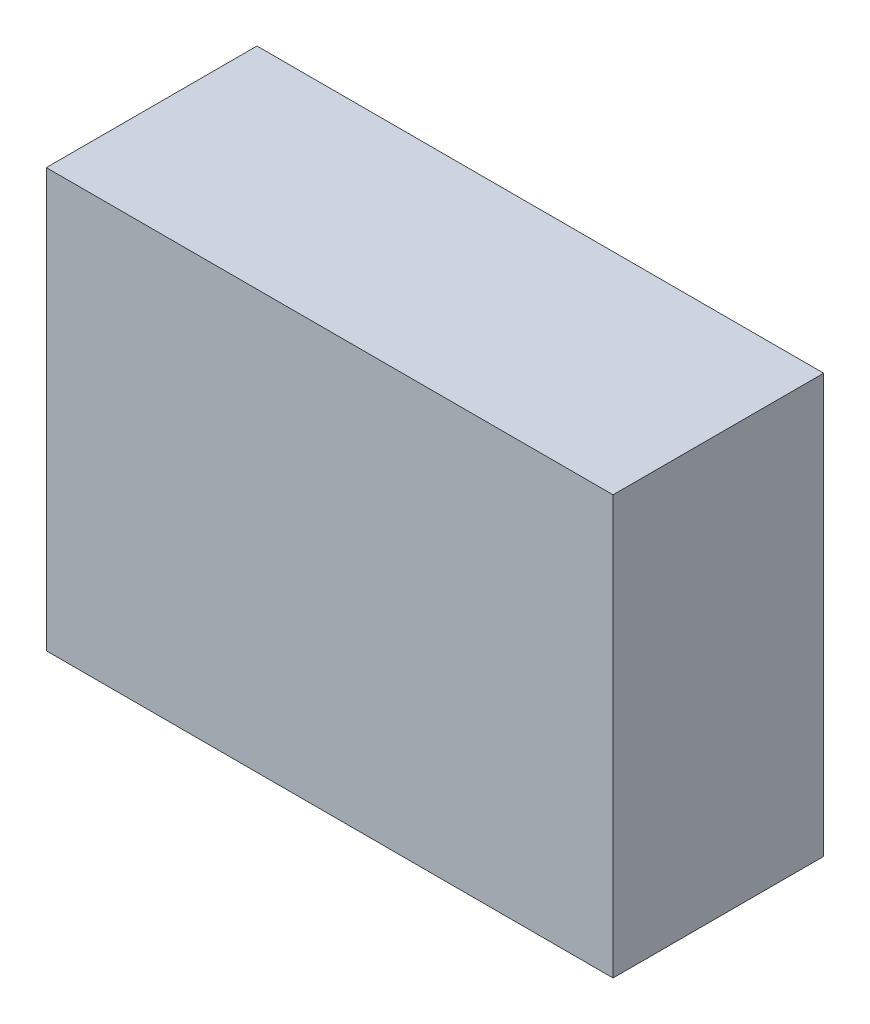
ISO-10303-21;
HEADER;
FILE_DESCRIPTION(('STEP AP214'),'2;1');
FILE_NAME('part.step','',(''),(''),'','','');
FILE_SCHEMA(('AUTOMOTIVE_DESIGN { 1 0 10303 214 1 1 1 1 }'));
ENDSEC;
DATA;
#1=APPLICATION_CONTEXT('core data for automotive mechanical design processes');
#2=APPLICATION_PROTOCOL_DEFINITION('international standard','automotive_design',2000,#1);
#3=PRODUCT_CONTEXT('',#1,'mechanical');
#4=PRODUCT('Part','Part','',(#3));
#5=PRODUCT_RELATED_PRODUCT_CATEGORY('part','',(#4));
#6=PRODUCT_DEFINITION_FORMATION('','',#4);
#7=PRODUCT_DEFINITION_CONTEXT('part definition',#1,'design');
#8=PRODUCT_DEFINITION('design','',#6,#7);
#9=PRODUCT_DEFINITION_SHAPE('','',#8);
#10=(LENGTH_UNIT() NAMED_UNIT(*) SI_UNIT(.MILLI.,.METRE.));
#11=(NAMED_UNIT(*) PLANE_ANGLE_UNIT() SI_UNIT($,.RADIAN.));
#12=(NAMED_UNIT(*) SI_UNIT($,.STERADIAN.) SOLID_ANGLE_UNIT());
#13=UNCERTAINTY_MEASURE_WITH_UNIT(LENGTH_MEASURE(1.E-05),#10,'distance_accuracy_value','');
#14=(GEOMETRIC_REPRESENTATION_CONTEXT(3) GLOBAL_UNCERTAINTY_ASSIGNED_CONTEXT((#13)) GLOBAL_UNIT_ASSIGNED_CONTEXT((#10,
#11,#12)) REPRESENTATION_CONTEXT('',''));
#15=CARTESIAN_POINT('',(0.,0.,0.));
#16=DIRECTION('',(0.,0.,1.));
#17=DIRECTION('',(1.,0.,0.));
#18=AXIS2_PLACEMENT_3D('',#15,#16,#17);
#19=CARTESIAN_POINT('',(0.,0.,1.52));
#20=DIRECTION('',(0.,1.,0.));
#21=DIRECTION('',(0.,0.,1.));
#22=AXIS2_PLACEMENT_3D('',#19,#20,#21);
#23=PLANE('',#22);
#24=DIRECTION('',(1.,0.,0.));
#25=VECTOR('',#24,1.);
#26=CARTESIAN_POINT('',(0.,0.,0.));
#27=LINE('',#26,#25);
#28=CARTESIAN_POINT('',(0.,0.,0.));
#29=VERTEX_POINT('',#28);
#30=CARTESIAN_POINT('',(4.09,0.,0.));
#31=VERTEX_POINT('',#30);
#32=EDGE_CURVE('E95',#29,#31,#27,.T.);
#33=ORIENTED_EDGE('',*,*,#32,.T.);
#34=DIRECTION('',(0.,0.,-1.));
#35=VECTOR('',#34,1.);
#36=CARTESIAN_POINT('',(4.09,0.,1.52));
#37=LINE('',#36,#35);
#38=CARTESIAN_POINT('',(4.09,0.,1.52));
#39=VERTEX_POINT('',#38);
#40=EDGE_CURVE('E11',#39,#31,#37,.T.);
#41=ORIENTED_EDGE('',*,*,#40,.F.);
#42=DIRECTION('',(1.,0.,0.));
#43=VECTOR('',#42,1.);
#44=CARTESIAN_POINT('',(0.,0.,1.52));
#45=LINE('',#44,#43);
#46=CARTESIAN_POINT('',(0.,0.,1.52));
#47=VERTEX_POINT('',#46);
#48=EDGE_CURVE('E81',#47,#39,#45,.T.);
#49=ORIENTED_EDGE('',*,*,#48,.F.);
#50=DIRECTION('',(0.,0.,-1.));
#51=VECTOR('',#50,1.);
#52=CARTESIAN_POINT('',(0.,0.,1.52));
#53=LINE('',#52,#51);
#54=EDGE_CURVE('E48',#47,#29,#53,.T.);
#55=ORIENTED_EDGE('',*,*,#54,.T.);
#56=EDGE_LOOP('',(#33,#41,#49,#55));
#57=FACE_BOUND('',#56,.T.);
#58=ADVANCED_FACE('F32',(#57),#23,.F.);
#59=CARTESIAN_POINT('',(4.09,0.,1.52));
#60=DIRECTION('',(-1.,0.,0.));
#61=DIRECTION('',(0.,0.,1.));
#62=AXIS2_PLACEMENT_3D('',#59,#60,#61);
#63=PLANE('',#62);
#64=DIRECTION('',(0.,1.,0.));
#65=VECTOR('',#64,1.);
#66=CARTESIAN_POINT('',(4.09,0.,0.));
#67=LINE('',#66,#65);
#68=CARTESIAN_POINT('',(4.09,3.02,0.));
#69=VERTEX_POINT('',#68);
#70=EDGE_CURVE('E86',#31,#69,#67,.T.);
#71=ORIENTED_EDGE('',*,*,#70,.T.);
#72=DIRECTION('',(0.,0.,-1.));
#73=VECTOR('',#72,1.);
#74=CARTESIAN_POINT('',(4.09,3.02,1.52));
#75=LINE('',#74,#73);
#76=CARTESIAN_POINT('',(4.09,3.02,1.52));
#77=VERTEX_POINT('',#76);
#78=EDGE_CURVE('E40',#77,#69,#75,.T.);
#79=ORIENTED_EDGE('',*,*,#78,.F.);
#80=DIRECTION('',(0.,1.,0.));
#81=VECTOR('',#80,1.);
#82=CARTESIAN_POINT('',(4.09,0.,1.52));
#83=LINE('',#82,#81);
#84=EDGE_CURVE('E73',#39,#77,#83,.T.);
#85=ORIENTED_EDGE('',*,*,#84,.F.);
#86=ORIENTED_EDGE('',*,*,#40,.T.);
#87=EDGE_LOOP('',(#71,#79,#85,#86));
#88=FACE_BOUND('',#87,.T.);
#89=ADVANCED_FACE('F85',(#88),#63,.F.);
#90=CARTESIAN_POINT('',(0.,3.02,1.52));
#91=DIRECTION('',(0.,1.,0.));
#92=DIRECTION('',(0.,0.,1.));
#93=AXIS2_PLACEMENT_3D('',#90,#91,#92);
#94=PLANE('',#93);
#95=DIRECTION('',(1.,0.,0.));
#96=VECTOR('',#95,1.);
#97=CARTESIAN_POINT('',(0.,3.02,0.));
#98=LINE('',#97,#96);
#99=CARTESIAN_POINT('',(0.,3.02,0.));
#100=VERTEX_POINT('',#99);
#101=EDGE_CURVE('E98',#100,#69,#98,.T.);
#102=ORIENTED_EDGE('',*,*,#101,.F.);
#103=DIRECTION('',(0.,0.,-1.));
#104=VECTOR('',#103,1.);
#105=CARTESIAN_POINT('',(0.,3.02,1.52));
#106=LINE('',#105,#104);
#107=CARTESIAN_POINT('',(0.,3.02,1.52));
#108=VERTEX_POINT('',#107);
#109=EDGE_CURVE('E62',#108,#100,#106,.T.);
#110=ORIENTED_EDGE('',*,*,#109,.F.);
#111=DIRECTION('',(1.,0.,0.));
#112=VECTOR('',#111,1.);
#113=CARTESIAN_POINT('',(0.,3.02,1.52));
#114=LINE('',#113,#112);
#115=EDGE_CURVE('E80',#108,#77,#114,.T.);
#116=ORIENTED_EDGE('',*,*,#115,.T.);
#117=ORIENTED_EDGE('',*,*,#78,.T.);
#118=EDGE_LOOP('',(#102,#110,#116,#117));
#119=FACE_BOUND('',#118,.T.);
#120=ADVANCED_FACE('F89',(#119),#94,.T.);
#121=CARTESIAN_POINT('',(0.,0.,1.52));
#122=DIRECTION('',(-1.,0.,0.));
#123=DIRECTION('',(0.,0.,1.));
#124=AXIS2_PLACEMENT_3D('',#121,#122,#123);
#125=PLANE('',#124);
#126=DIRECTION('',(0.,1.,0.));
#127=VECTOR('',#126,1.);
#128=CARTESIAN_POINT('',(0.,0.,0.));
#129=LINE('',#128,#127);
#130=EDGE_CURVE('E100',#29,#100,#129,.T.);
#131=ORIENTED_EDGE('',*,*,#130,.F.);
#132=ORIENTED_EDGE('',*,*,#54,.F.);
#133=DIRECTION('',(0.,1.,0.));
#134=VECTOR('',#133,1.);
#135=CARTESIAN_POINT('',(0.,0.,1.52));
#136=LINE('',#135,#134);
#137=EDGE_CURVE('E90',#47,#108,#136,.T.);
#138=ORIENTED_EDGE('',*,*,#137,.T.);
#139=ORIENTED_EDGE('',*,*,#109,.T.);
#140=EDGE_LOOP('',(#131,#132,#138,#139));
#141=FACE_BOUND('',#140,.T.);
#142=ADVANCED_FACE('F106',(#141),#125,.T.);
#143=CARTESIAN_POINT('',(0.,0.,1.52));
#144=DIRECTION('',(0.,0.,1.));
#145=DIRECTION('',(1.,0.,0.));
#146=AXIS2_PLACEMENT_3D('',#143,#144,#145);
#147=PLANE('',#146);
#148=ORIENTED_EDGE('',*,*,#48,.T.);
#149=ORIENTED_EDGE('',*,*,#84,.T.);
#150=ORIENTED_EDGE('',*,*,#115,.F.);
#151=ORIENTED_EDGE('',*,*,#137,.F.);
#152=EDGE_LOOP('',(#148,#149,#150,#151));
#153=FACE_BOUND('',#152,.T.);
#154=ADVANCED_FACE('F77',(#153),#147,.T.);
#155=CARTESIAN_POINT('',(0.,0.,0.));
#156=DIRECTION('',(0.,0.,1.));
#157=DIRECTION('',(1.,0.,0.));
#158=AXIS2_PLACEMENT_3D('',#155,#156,#157);
#159=PLANE('',#158);
#160=ORIENTED_EDGE('',*,*,#32,.F.);
#161=ORIENTED_EDGE('',*,*,#130,.T.);
#162=ORIENTED_EDGE('',*,*,#101,.T.);
#163=ORIENTED_EDGE('',*,*,#70,.F.);
#164=EDGE_LOOP('',(#160,#161,#162,#163));
#165=FACE_BOUND('',#164,.T.);
#166=ADVANCED_FACE('F105',(#165),#159,.F.);
#167=CLOSED_SHELL('',(#58,#89,#120,#142,#154,#166));
#168=MANIFOLD_SOLID_BREP('B2',#167);
#169=ADVANCED_BREP_SHAPE_REPRESENTATION('',(#18,#168),#14);
#170=SHAPE_DEFINITION_REPRESENTATION(#9,#169);
ENDSEC;
END-ISO-10303-21;
